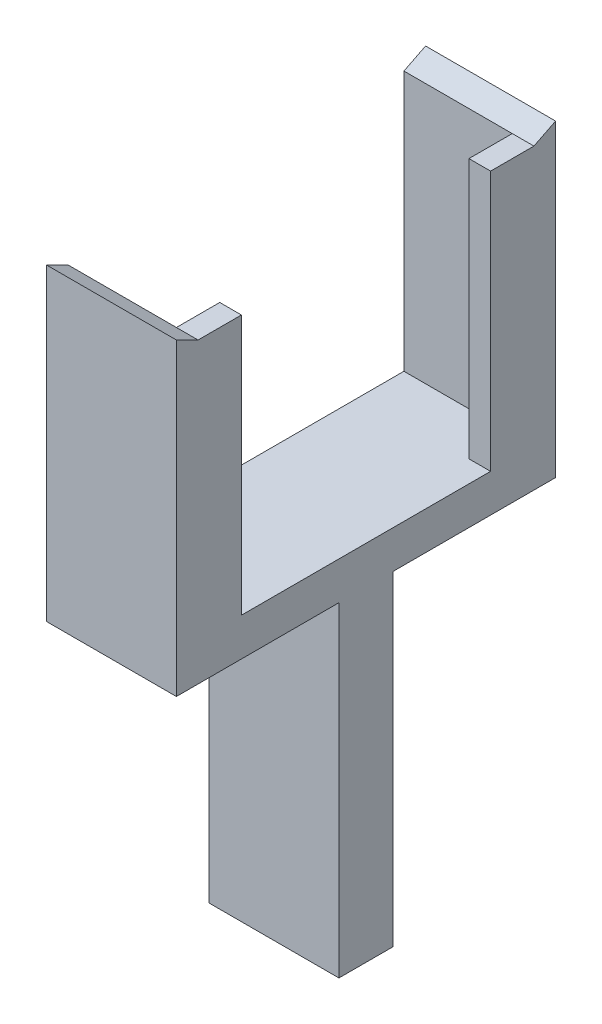
ISO-10303-21;
HEADER;
FILE_DESCRIPTION(('STEP AP214'),'2;1');
FILE_NAME('part.step','',(''),(''),'','','');
FILE_SCHEMA(('AUTOMOTIVE_DESIGN { 1 0 10303 214 1 1 1 1 }'));
ENDSEC;
DATA;
#1=APPLICATION_CONTEXT('core data for automotive mechanical design processes');
#2=APPLICATION_PROTOCOL_DEFINITION('international standard','automotive_design',2000,#1);
#3=PRODUCT_CONTEXT('',#1,'mechanical');
#4=PRODUCT('Part','Part','',(#3));
#5=PRODUCT_RELATED_PRODUCT_CATEGORY('part','',(#4));
#6=PRODUCT_DEFINITION_FORMATION('','',#4);
#7=PRODUCT_DEFINITION_CONTEXT('part definition',#1,'design');
#8=PRODUCT_DEFINITION('design','',#6,#7);
#9=PRODUCT_DEFINITION_SHAPE('','',#8);
#10=(LENGTH_UNIT() NAMED_UNIT(*) SI_UNIT(.MILLI.,.METRE.));
#11=(NAMED_UNIT(*) PLANE_ANGLE_UNIT() SI_UNIT($,.RADIAN.));
#12=(NAMED_UNIT(*) SI_UNIT($,.STERADIAN.) SOLID_ANGLE_UNIT());
#13=UNCERTAINTY_MEASURE_WITH_UNIT(LENGTH_MEASURE(1.E-05),#10,'distance_accuracy_value','');
#14=(GEOMETRIC_REPRESENTATION_CONTEXT(3) GLOBAL_UNCERTAINTY_ASSIGNED_CONTEXT((#13)) GLOBAL_UNIT_ASSIGNED_CONTEXT((#10,
#11,#12)) REPRESENTATION_CONTEXT('',''));
#15=CARTESIAN_POINT('',(0.,0.,0.));
#16=DIRECTION('',(0.,0.,1.));
#17=DIRECTION('',(1.,0.,0.));
#18=AXIS2_PLACEMENT_3D('',#15,#16,#17);
#19=CARTESIAN_POINT('',(6.,5.64115646258503,15.5));
#20=DIRECTION('',(0.,-1.,0.));
#21=DIRECTION('',(0.,0.,-1.));
#22=AXIS2_PLACEMENT_3D('',#19,#20,#21);
#23=PLANE('',#22);
#24=DIRECTION('',(-1.,0.,0.));
#25=VECTOR('',#24,1.);
#26=CARTESIAN_POINT('',(6.,5.64115646258503,-11.5));
#27=LINE('',#26,#25);
#28=CARTESIAN_POINT('',(6.,5.64115646258503,-11.5));
#29=VERTEX_POINT('',#28);
#30=CARTESIAN_POINT('',(4.,5.64115646258503,-11.5));
#31=VERTEX_POINT('',#30);
#32=EDGE_CURVE('E268',#29,#31,#27,.T.);
#33=ORIENTED_EDGE('',*,*,#32,.T.);
#34=DIRECTION('',(0.,0.,-1.));
#35=VECTOR('',#34,1.);
#36=CARTESIAN_POINT('',(4.,5.64115646258503,-11.5));
#37=LINE('',#36,#35);
#38=CARTESIAN_POINT('',(4.,5.64115646258503,-15.5));
#39=VERTEX_POINT('',#38);
#40=EDGE_CURVE('E265',#31,#39,#37,.T.);
#41=ORIENTED_EDGE('',*,*,#40,.T.);
#42=DIRECTION('',(-1.,0.,0.));
#43=VECTOR('',#42,1.);
#44=CARTESIAN_POINT('',(6.,5.64115646258503,-15.5));
#45=LINE('',#44,#43);
#46=CARTESIAN_POINT('',(-6.,5.64115646258503,-15.5));
#47=VERTEX_POINT('',#46);
#48=EDGE_CURVE('E190',#39,#47,#45,.T.);
#49=ORIENTED_EDGE('',*,*,#48,.T.);
#50=DIRECTION('',(0.,0.,1.));
#51=VECTOR('',#50,1.);
#52=CARTESIAN_POINT('',(-6.,5.64115646258503,15.5));
#53=LINE('',#52,#51);
#54=CARTESIAN_POINT('',(-6.,5.64115646258503,15.5));
#55=VERTEX_POINT('',#54);
#56=EDGE_CURVE('E169',#47,#55,#53,.T.);
#57=ORIENTED_EDGE('',*,*,#56,.T.);
#58=DIRECTION('',(-1.,0.,0.));
#59=VECTOR('',#58,1.);
#60=CARTESIAN_POINT('',(6.,5.64115646258503,15.5));
#61=LINE('',#60,#59);
#62=CARTESIAN_POINT('',(4.,5.64115646258503,15.5));
#63=VERTEX_POINT('',#62);
#64=EDGE_CURVE('E188',#63,#55,#61,.T.);
#65=ORIENTED_EDGE('',*,*,#64,.F.);
#66=DIRECTION('',(0.,0.,1.));
#67=VECTOR('',#66,1.);
#68=CARTESIAN_POINT('',(4.,5.64115646258503,11.5));
#69=LINE('',#68,#67);
#70=CARTESIAN_POINT('',(4.,5.64115646258503,11.5));
#71=VERTEX_POINT('',#70);
#72=EDGE_CURVE('E157',#71,#63,#69,.T.);
#73=ORIENTED_EDGE('',*,*,#72,.F.);
#74=DIRECTION('',(-1.,0.,0.));
#75=VECTOR('',#74,1.);
#76=CARTESIAN_POINT('',(6.,5.64115646258503,11.5));
#77=LINE('',#76,#75);
#78=CARTESIAN_POINT('',(6.,5.64115646258503,11.5));
#79=VERTEX_POINT('',#78);
#80=EDGE_CURVE('E255',#79,#71,#77,.T.);
#81=ORIENTED_EDGE('',*,*,#80,.F.);
#82=DIRECTION('',(0.,0.,1.));
#83=VECTOR('',#82,1.);
#84=CARTESIAN_POINT('',(6.,5.64115646258503,15.5));
#85=LINE('',#84,#83);
#86=EDGE_CURVE('E227',#29,#79,#85,.T.);
#87=ORIENTED_EDGE('',*,*,#86,.F.);
#88=EDGE_LOOP('',(#33,#41,#49,#57,#65,#73,#81,#87));
#89=FACE_BOUND('',#88,.T.);
#90=ADVANCED_FACE('F36',(#89),#23,.F.);
#91=CARTESIAN_POINT('',(6.,29.641156462585,15.5));
#92=DIRECTION('',(0.,0.,1.));
#93=DIRECTION('',(0.,-1.,0.));
#94=AXIS2_PLACEMENT_3D('',#91,#92,#93);
#95=PLANE('',#94);
#96=DIRECTION('',(0.,1.,0.));
#97=VECTOR('',#96,1.);
#98=CARTESIAN_POINT('',(4.,29.641156462585,15.5));
#99=LINE('',#98,#97);
#100=CARTESIAN_POINT('',(4.,29.641156462585,15.5));
#101=VERTEX_POINT('',#100);
#102=EDGE_CURVE('E245',#63,#101,#99,.T.);
#103=ORIENTED_EDGE('',*,*,#102,.F.);
#104=ORIENTED_EDGE('',*,*,#64,.T.);
#105=DIRECTION('',(0.,1.,0.));
#106=VECTOR('',#105,1.);
#107=CARTESIAN_POINT('',(-6.,29.641156462585,15.5));
#108=LINE('',#107,#106);
#109=CARTESIAN_POINT('',(-6.,29.641156462585,15.5));
#110=VERTEX_POINT('',#109);
#111=EDGE_CURVE('E172',#55,#110,#108,.T.);
#112=ORIENTED_EDGE('',*,*,#111,.T.);
#113=DIRECTION('',(-1.,0.,0.));
#114=VECTOR('',#113,1.);
#115=CARTESIAN_POINT('',(6.,29.641156462585,15.5));
#116=LINE('',#115,#114);
#117=EDGE_CURVE('E184',#101,#110,#116,.T.);
#118=ORIENTED_EDGE('',*,*,#117,.F.);
#119=EDGE_LOOP('',(#103,#104,#112,#118));
#120=FACE_BOUND('',#119,.T.);
#121=ADVANCED_FACE('F341',(#120),#95,.F.);
#122=CARTESIAN_POINT('',(6.,-27.858843537415,2.49999999999999));
#123=DIRECTION('',(0.,1.,0.));
#124=DIRECTION('',(0.,0.,1.));
#125=AXIS2_PLACEMENT_3D('',#122,#123,#124);
#126=PLANE('',#125);
#127=DIRECTION('',(0.,0.,-1.));
#128=VECTOR('',#127,1.);
#129=CARTESIAN_POINT('',(-6.,-27.858843537415,2.49999999999999));
#130=LINE('',#129,#128);
#131=CARTESIAN_POINT('',(-6.,-27.858843537415,2.49999999999999));
#132=VERTEX_POINT('',#131);
#133=CARTESIAN_POINT('',(-6.,-27.858843537415,-2.50000000000001));
#134=VERTEX_POINT('',#133);
#135=EDGE_CURVE('E153',#132,#134,#130,.T.);
#136=ORIENTED_EDGE('',*,*,#135,.T.);
#137=DIRECTION('',(-1.,0.,0.));
#138=VECTOR('',#137,1.);
#139=CARTESIAN_POINT('',(6.,-27.858843537415,-2.50000000000001));
#140=LINE('',#139,#138);
#141=CARTESIAN_POINT('',(6.,-27.858843537415,-2.50000000000001));
#142=VERTEX_POINT('',#141);
#143=EDGE_CURVE('E11',#142,#134,#140,.T.);
#144=ORIENTED_EDGE('',*,*,#143,.F.);
#145=DIRECTION('',(0.,0.,-1.));
#146=VECTOR('',#145,1.);
#147=CARTESIAN_POINT('',(6.,-27.858843537415,2.49999999999999));
#148=LINE('',#147,#146);
#149=CARTESIAN_POINT('',(6.,-27.858843537415,2.49999999999999));
#150=VERTEX_POINT('',#149);
#151=EDGE_CURVE('E180',#150,#142,#148,.T.);
#152=ORIENTED_EDGE('',*,*,#151,.F.);
#153=DIRECTION('',(-1.,0.,0.));
#154=VECTOR('',#153,1.);
#155=CARTESIAN_POINT('',(6.,-27.858843537415,2.49999999999999));
#156=LINE('',#155,#154);
#157=EDGE_CURVE('E149',#150,#132,#156,.T.);
#158=ORIENTED_EDGE('',*,*,#157,.T.);
#159=EDGE_LOOP('',(#136,#144,#152,#158));
#160=FACE_BOUND('',#159,.T.);
#161=ADVANCED_FACE('F38',(#160),#126,.F.);
#162=CARTESIAN_POINT('',(6.,-27.858843537415,-2.50000000000001));
#163=DIRECTION('',(0.,0.,1.));
#164=DIRECTION('',(0.,-1.,0.));
#165=AXIS2_PLACEMENT_3D('',#162,#163,#164);
#166=PLANE('',#165);
#167=DIRECTION('',(0.,1.,0.));
#168=VECTOR('',#167,1.);
#169=CARTESIAN_POINT('',(-6.,-27.858843537415,-2.50000000000001));
#170=LINE('',#169,#168);
#171=CARTESIAN_POINT('',(-6.,2.14115646258503,-2.5));
#172=VERTEX_POINT('',#171);
#173=EDGE_CURVE('E156',#134,#172,#170,.T.);
#174=ORIENTED_EDGE('',*,*,#173,.T.);
#175=DIRECTION('',(-1.,0.,0.));
#176=VECTOR('',#175,1.);
#177=CARTESIAN_POINT('',(6.,2.14115646258503,-2.5));
#178=LINE('',#177,#176);
#179=CARTESIAN_POINT('',(6.,2.14115646258503,-2.5));
#180=VERTEX_POINT('',#179);
#181=EDGE_CURVE('E45',#180,#172,#178,.T.);
#182=ORIENTED_EDGE('',*,*,#181,.F.);
#183=DIRECTION('',(0.,1.,0.));
#184=VECTOR('',#183,1.);
#185=CARTESIAN_POINT('',(6.,-27.858843537415,-2.50000000000001));
#186=LINE('',#185,#184);
#187=EDGE_CURVE('E109',#142,#180,#186,.T.);
#188=ORIENTED_EDGE('',*,*,#187,.F.);
#189=ORIENTED_EDGE('',*,*,#143,.T.);
#190=EDGE_LOOP('',(#174,#182,#188,#189));
#191=FACE_BOUND('',#190,.T.);
#192=ADVANCED_FACE('F372',(#191),#166,.F.);
#193=CARTESIAN_POINT('',(6.,2.14115646258503,-2.5));
#194=DIRECTION('',(0.,1.,0.));
#195=DIRECTION('',(0.,0.,1.));
#196=AXIS2_PLACEMENT_3D('',#193,#194,#195);
#197=PLANE('',#196);
#198=DIRECTION('',(0.,0.,-1.));
#199=VECTOR('',#198,1.);
#200=CARTESIAN_POINT('',(-6.,2.14115646258503,-2.5));
#201=LINE('',#200,#199);
#202=CARTESIAN_POINT('',(-6.,2.14115646258503,-17.5));
#203=VERTEX_POINT('',#202);
#204=EDGE_CURVE('E159',#172,#203,#201,.T.);
#205=ORIENTED_EDGE('',*,*,#204,.T.);
#206=DIRECTION('',(-1.,0.,0.));
#207=VECTOR('',#206,1.);
#208=CARTESIAN_POINT('',(6.,2.14115646258503,-17.5));
#209=LINE('',#208,#207);
#210=CARTESIAN_POINT('',(6.,2.14115646258503,-17.5));
#211=VERTEX_POINT('',#210);
#212=EDGE_CURVE('E199',#211,#203,#209,.T.);
#213=ORIENTED_EDGE('',*,*,#212,.F.);
#214=DIRECTION('',(0.,0.,-1.));
#215=VECTOR('',#214,1.);
#216=CARTESIAN_POINT('',(6.,2.14115646258503,-2.5));
#217=LINE('',#216,#215);
#218=EDGE_CURVE('E207',#180,#211,#217,.T.);
#219=ORIENTED_EDGE('',*,*,#218,.F.);
#220=ORIENTED_EDGE('',*,*,#181,.T.);
#221=EDGE_LOOP('',(#205,#213,#219,#220));
#222=FACE_BOUND('',#221,.T.);
#223=ADVANCED_FACE('F205',(#222),#197,.F.);
#224=CARTESIAN_POINT('',(6.,2.14115646258503,-17.5));
#225=DIRECTION('',(0.,0.,1.));
#226=DIRECTION('',(0.,-1.,0.));
#227=AXIS2_PLACEMENT_3D('',#224,#225,#226);
#228=PLANE('',#227);
#229=DIRECTION('',(0.,1.,0.));
#230=VECTOR('',#229,1.);
#231=CARTESIAN_POINT('',(-6.,2.14115646258503,-17.5));
#232=LINE('',#231,#230);
#233=CARTESIAN_POINT('',(-6.,30.641156462585,-17.5));
#234=VERTEX_POINT('',#233);
#235=EDGE_CURVE('E161',#203,#234,#232,.T.);
#236=ORIENTED_EDGE('',*,*,#235,.T.);
#237=DIRECTION('',(-1.,0.,0.));
#238=VECTOR('',#237,1.);
#239=CARTESIAN_POINT('',(6.,30.641156462585,-17.5));
#240=LINE('',#239,#238);
#241=CARTESIAN_POINT('',(6.,30.641156462585,-17.5));
#242=VERTEX_POINT('',#241);
#243=EDGE_CURVE('E196',#242,#234,#240,.T.);
#244=ORIENTED_EDGE('',*,*,#243,.F.);
#245=DIRECTION('',(0.,1.,0.));
#246=VECTOR('',#245,1.);
#247=CARTESIAN_POINT('',(6.,2.14115646258503,-17.5));
#248=LINE('',#247,#246);
#249=EDGE_CURVE('E228',#211,#242,#248,.T.);
#250=ORIENTED_EDGE('',*,*,#249,.F.);
#251=ORIENTED_EDGE('',*,*,#212,.T.);
#252=EDGE_LOOP('',(#236,#244,#250,#251));
#253=FACE_BOUND('',#252,.T.);
#254=ADVANCED_FACE('F216',(#253),#228,.F.);
#255=CARTESIAN_POINT('',(6.,30.641156462585,-17.5));
#256=DIRECTION('',(0.,-0.894427190999916,-0.447213595499958));
#257=DIRECTION('',(0.,0.447213595499958,-0.894427190999916));
#258=AXIS2_PLACEMENT_3D('',#255,#256,#257);
#259=PLANE('',#258);
#260=DIRECTION('',(0.,-0.447213595499958,0.894427190999916));
#261=VECTOR('',#260,1.);
#262=CARTESIAN_POINT('',(-6.,30.641156462585,-17.5));
#263=LINE('',#262,#261);
#264=CARTESIAN_POINT('',(-6.,29.641156462585,-15.5));
#265=VERTEX_POINT('',#264);
#266=EDGE_CURVE('E163',#234,#265,#263,.T.);
#267=ORIENTED_EDGE('',*,*,#266,.T.);
#268=DIRECTION('',(-1.,0.,0.));
#269=VECTOR('',#268,1.);
#270=CARTESIAN_POINT('',(6.,29.641156462585,-15.5));
#271=LINE('',#270,#269);
#272=CARTESIAN_POINT('',(4.,29.641156462585,-15.5));
#273=VERTEX_POINT('',#272);
#274=EDGE_CURVE('E192',#273,#265,#271,.T.);
#275=ORIENTED_EDGE('',*,*,#274,.F.);
#276=CARTESIAN_POINT('',(6.,29.641156462585,-15.5));
#277=VERTEX_POINT('',#276);
#278=EDGE_CURVE('E193',#277,#273,#271,.T.);
#279=ORIENTED_EDGE('',*,*,#278,.F.);
#280=DIRECTION('',(0.,-0.447213595499958,0.894427190999916));
#281=VECTOR('',#280,1.);
#282=CARTESIAN_POINT('',(6.,30.641156462585,-17.5));
#283=LINE('',#282,#281);
#284=EDGE_CURVE('E224',#242,#277,#283,.T.);
#285=ORIENTED_EDGE('',*,*,#284,.F.);
#286=ORIENTED_EDGE('',*,*,#243,.T.);
#287=EDGE_LOOP('',(#267,#275,#279,#285,#286));
#288=FACE_BOUND('',#287,.T.);
#289=ADVANCED_FACE('F220',(#288),#259,.F.);
#290=CARTESIAN_POINT('',(6.,29.641156462585,-15.5));
#291=DIRECTION('',(0.,0.,-1.));
#292=DIRECTION('',(0.,1.,0.));
#293=AXIS2_PLACEMENT_3D('',#290,#291,#292);
#294=PLANE('',#293);
#295=ORIENTED_EDGE('',*,*,#48,.F.);
#296=DIRECTION('',(0.,1.,0.));
#297=VECTOR('',#296,1.);
#298=CARTESIAN_POINT('',(4.,29.641156462585,-15.5));
#299=LINE('',#298,#297);
#300=EDGE_CURVE('E269',#39,#273,#299,.T.);
#301=ORIENTED_EDGE('',*,*,#300,.T.);
#302=ORIENTED_EDGE('',*,*,#274,.T.);
#303=DIRECTION('',(0.,-1.,0.));
#304=VECTOR('',#303,1.);
#305=CARTESIAN_POINT('',(-6.,29.641156462585,-15.5));
#306=LINE('',#305,#304);
#307=EDGE_CURVE('E166',#265,#47,#306,.T.);
#308=ORIENTED_EDGE('',*,*,#307,.T.);
#309=EDGE_LOOP('',(#295,#301,#302,#308));
#310=FACE_BOUND('',#309,.T.);
#311=ADVANCED_FACE('F336',(#310),#294,.F.);
#312=CARTESIAN_POINT('',(6.,30.641156462585,17.5));
#313=DIRECTION('',(0.,-0.894427190999916,0.447213595499958));
#314=DIRECTION('',(0.,-0.447213595499958,-0.894427190999916));
#315=AXIS2_PLACEMENT_3D('',#312,#313,#314);
#316=PLANE('',#315);
#317=DIRECTION('',(0.,0.447213595499958,0.894427190999916));
#318=VECTOR('',#317,1.);
#319=CARTESIAN_POINT('',(-6.,30.641156462585,17.5));
#320=LINE('',#319,#318);
#321=CARTESIAN_POINT('',(-6.,30.641156462585,17.5));
#322=VERTEX_POINT('',#321);
#323=EDGE_CURVE('E175',#110,#322,#320,.T.);
#324=ORIENTED_EDGE('',*,*,#323,.T.);
#325=DIRECTION('',(-1.,0.,0.));
#326=VECTOR('',#325,1.);
#327=CARTESIAN_POINT('',(6.,30.641156462585,17.5));
#328=LINE('',#327,#326);
#329=CARTESIAN_POINT('',(6.,30.641156462585,17.5));
#330=VERTEX_POINT('',#329);
#331=EDGE_CURVE('E144',#330,#322,#328,.T.);
#332=ORIENTED_EDGE('',*,*,#331,.F.);
#333=DIRECTION('',(0.,0.447213595499958,0.894427190999916));
#334=VECTOR('',#333,1.);
#335=CARTESIAN_POINT('',(6.,30.641156462585,17.5));
#336=LINE('',#335,#334);
#337=CARTESIAN_POINT('',(6.,29.641156462585,15.5));
#338=VERTEX_POINT('',#337);
#339=EDGE_CURVE('E135',#338,#330,#336,.T.);
#340=ORIENTED_EDGE('',*,*,#339,.F.);
#341=EDGE_CURVE('E185',#338,#101,#116,.T.);
#342=ORIENTED_EDGE('',*,*,#341,.T.);
#343=ORIENTED_EDGE('',*,*,#117,.T.);
#344=EDGE_LOOP('',(#324,#332,#340,#342,#343));
#345=FACE_BOUND('',#344,.T.);
#346=ADVANCED_FACE('F343',(#345),#316,.F.);
#347=CARTESIAN_POINT('',(6.,2.14115646258502,17.5));
#348=DIRECTION('',(0.,0.,-1.));
#349=DIRECTION('',(0.,1.,0.));
#350=AXIS2_PLACEMENT_3D('',#347,#348,#349);
#351=PLANE('',#350);
#352=DIRECTION('',(0.,-1.,0.));
#353=VECTOR('',#352,1.);
#354=CARTESIAN_POINT('',(-6.,2.14115646258502,17.5));
#355=LINE('',#354,#353);
#356=CARTESIAN_POINT('',(-6.,2.14115646258502,17.5));
#357=VERTEX_POINT('',#356);
#358=EDGE_CURVE('E143',#322,#357,#355,.T.);
#359=ORIENTED_EDGE('',*,*,#358,.T.);
#360=DIRECTION('',(-1.,0.,0.));
#361=VECTOR('',#360,1.);
#362=CARTESIAN_POINT('',(6.,2.14115646258502,17.5));
#363=LINE('',#362,#361);
#364=CARTESIAN_POINT('',(6.,2.14115646258502,17.5));
#365=VERTEX_POINT('',#364);
#366=EDGE_CURVE('E140',#365,#357,#363,.T.);
#367=ORIENTED_EDGE('',*,*,#366,.F.);
#368=DIRECTION('',(0.,-1.,0.));
#369=VECTOR('',#368,1.);
#370=CARTESIAN_POINT('',(6.,2.14115646258502,17.5));
#371=LINE('',#370,#369);
#372=EDGE_CURVE('E128',#330,#365,#371,.T.);
#373=ORIENTED_EDGE('',*,*,#372,.F.);
#374=ORIENTED_EDGE('',*,*,#331,.T.);
#375=EDGE_LOOP('',(#359,#367,#373,#374));
#376=FACE_BOUND('',#375,.T.);
#377=ADVANCED_FACE('F141',(#376),#351,.F.);
#378=CARTESIAN_POINT('',(6.,2.14115646258503,2.49999999999999));
#379=DIRECTION('',(0.,1.,0.));
#380=DIRECTION('',(0.,0.,1.));
#381=AXIS2_PLACEMENT_3D('',#378,#379,#380);
#382=PLANE('',#381);
#383=DIRECTION('',(0.,0.,-1.));
#384=VECTOR('',#383,1.);
#385=CARTESIAN_POINT('',(-6.,2.14115646258503,2.49999999999999));
#386=LINE('',#385,#384);
#387=CARTESIAN_POINT('',(-6.,2.14115646258503,2.49999999999999));
#388=VERTEX_POINT('',#387);
#389=EDGE_CURVE('E95',#357,#388,#386,.T.);
#390=ORIENTED_EDGE('',*,*,#389,.T.);
#391=DIRECTION('',(-1.,0.,0.));
#392=VECTOR('',#391,1.);
#393=CARTESIAN_POINT('',(6.,2.14115646258503,2.49999999999999));
#394=LINE('',#393,#392);
#395=CARTESIAN_POINT('',(6.,2.14115646258503,2.49999999999999));
#396=VERTEX_POINT('',#395);
#397=EDGE_CURVE('E145',#396,#388,#394,.T.);
#398=ORIENTED_EDGE('',*,*,#397,.F.);
#399=DIRECTION('',(0.,0.,-1.));
#400=VECTOR('',#399,1.);
#401=CARTESIAN_POINT('',(6.,2.14115646258503,2.49999999999999));
#402=LINE('',#401,#400);
#403=EDGE_CURVE('E133',#365,#396,#402,.T.);
#404=ORIENTED_EDGE('',*,*,#403,.F.);
#405=ORIENTED_EDGE('',*,*,#366,.T.);
#406=EDGE_LOOP('',(#390,#398,#404,#405));
#407=FACE_BOUND('',#406,.T.);
#408=ADVANCED_FACE('F147',(#407),#382,.F.);
#409=CARTESIAN_POINT('',(6.,-27.858843537415,2.49999999999999));
#410=DIRECTION('',(0.,0.,-1.));
#411=DIRECTION('',(-1.,0.,0.));
#412=AXIS2_PLACEMENT_3D('',#409,#410,#411);
#413=PLANE('',#412);
#414=DIRECTION('',(0.,-1.,0.));
#415=VECTOR('',#414,1.);
#416=CARTESIAN_POINT('',(-6.,-27.858843537415,2.49999999999999));
#417=LINE('',#416,#415);
#418=EDGE_CURVE('E101',#388,#132,#417,.T.);
#419=ORIENTED_EDGE('',*,*,#418,.T.);
#420=ORIENTED_EDGE('',*,*,#157,.F.);
#421=DIRECTION('',(0.,-1.,0.));
#422=VECTOR('',#421,1.);
#423=CARTESIAN_POINT('',(6.,-27.858843537415,2.49999999999999));
#424=LINE('',#423,#422);
#425=EDGE_CURVE('E53',#396,#150,#424,.T.);
#426=ORIENTED_EDGE('',*,*,#425,.F.);
#427=ORIENTED_EDGE('',*,*,#397,.T.);
#428=EDGE_LOOP('',(#419,#420,#426,#427));
#429=FACE_BOUND('',#428,.T.);
#430=ADVANCED_FACE('F347',(#429),#413,.F.);
#431=CARTESIAN_POINT('',(6.,0.,0.));
#432=DIRECTION('',(1.,0.,0.));
#433=DIRECTION('',(0.,0.,-1.));
#434=AXIS2_PLACEMENT_3D('',#431,#432,#433);
#435=PLANE('',#434);
#436=DIRECTION('',(0.,-1.,0.));
#437=VECTOR('',#436,1.);
#438=CARTESIAN_POINT('',(6.,29.641156462585,-11.5));
#439=LINE('',#438,#437);
#440=CARTESIAN_POINT('',(6.,29.641156462585,-11.5));
#441=VERTEX_POINT('',#440);
#442=EDGE_CURVE('E272',#441,#29,#439,.T.);
#443=ORIENTED_EDGE('',*,*,#442,.T.);
#444=ORIENTED_EDGE('',*,*,#86,.T.);
#445=DIRECTION('',(0.,-1.,0.));
#446=VECTOR('',#445,1.);
#447=CARTESIAN_POINT('',(6.,29.641156462585,11.5));
#448=LINE('',#447,#446);
#449=CARTESIAN_POINT('',(6.,29.641156462585,11.5));
#450=VERTEX_POINT('',#449);
#451=EDGE_CURVE('E248',#450,#79,#448,.T.);
#452=ORIENTED_EDGE('',*,*,#451,.F.);
#453=DIRECTION('',(0.,0.,1.));
#454=VECTOR('',#453,1.);
#455=CARTESIAN_POINT('',(6.,29.641156462585,11.5));
#456=LINE('',#455,#454);
#457=EDGE_CURVE('E242',#450,#338,#456,.T.);
#458=ORIENTED_EDGE('',*,*,#457,.T.);
#459=ORIENTED_EDGE('',*,*,#339,.T.);
#460=ORIENTED_EDGE('',*,*,#372,.T.);
#461=ORIENTED_EDGE('',*,*,#403,.T.);
#462=ORIENTED_EDGE('',*,*,#425,.T.);
#463=ORIENTED_EDGE('',*,*,#151,.T.);
#464=ORIENTED_EDGE('',*,*,#187,.T.);
#465=ORIENTED_EDGE('',*,*,#218,.T.);
#466=ORIENTED_EDGE('',*,*,#249,.T.);
#467=ORIENTED_EDGE('',*,*,#284,.T.);
#468=DIRECTION('',(0.,0.,-1.));
#469=VECTOR('',#468,1.);
#470=CARTESIAN_POINT('',(6.,29.641156462585,-11.5));
#471=LINE('',#470,#469);
#472=EDGE_CURVE('E249',#441,#277,#471,.T.);
#473=ORIENTED_EDGE('',*,*,#472,.F.);
#474=EDGE_LOOP('',(#443,#444,#452,#458,#459,#460,#461,#462,#463,#464,#465,#466,#467,#473));
#475=FACE_BOUND('',#474,.T.);
#476=ADVANCED_FACE('F131',(#475),#435,.T.);
#477=CARTESIAN_POINT('',(-6.,0.,0.));
#478=DIRECTION('',(1.,0.,0.));
#479=DIRECTION('',(0.,0.,-1.));
#480=AXIS2_PLACEMENT_3D('',#477,#478,#479);
#481=PLANE('',#480);
#482=ORIENTED_EDGE('',*,*,#135,.F.);
#483=ORIENTED_EDGE('',*,*,#418,.F.);
#484=ORIENTED_EDGE('',*,*,#389,.F.);
#485=ORIENTED_EDGE('',*,*,#358,.F.);
#486=ORIENTED_EDGE('',*,*,#323,.F.);
#487=ORIENTED_EDGE('',*,*,#111,.F.);
#488=ORIENTED_EDGE('',*,*,#56,.F.);
#489=ORIENTED_EDGE('',*,*,#307,.F.);
#490=ORIENTED_EDGE('',*,*,#266,.F.);
#491=ORIENTED_EDGE('',*,*,#235,.F.);
#492=ORIENTED_EDGE('',*,*,#204,.F.);
#493=ORIENTED_EDGE('',*,*,#173,.F.);
#494=EDGE_LOOP('',(#482,#483,#484,#485,#486,#487,#488,#489,#490,#491,#492,#493));
#495=FACE_BOUND('',#494,.T.);
#496=ADVANCED_FACE('F211',(#495),#481,.F.);
#497=CARTESIAN_POINT('',(4.,29.641156462585,11.5));
#498=DIRECTION('',(1.,0.,0.));
#499=DIRECTION('',(0.,1.,0.));
#500=AXIS2_PLACEMENT_3D('',#497,#498,#499);
#501=PLANE('',#500);
#502=ORIENTED_EDGE('',*,*,#102,.T.);
#503=DIRECTION('',(0.,0.,1.));
#504=VECTOR('',#503,1.);
#505=CARTESIAN_POINT('',(4.,29.641156462585,11.5));
#506=LINE('',#505,#504);
#507=CARTESIAN_POINT('',(4.,29.641156462585,11.5));
#508=VERTEX_POINT('',#507);
#509=EDGE_CURVE('E239',#508,#101,#506,.T.);
#510=ORIENTED_EDGE('',*,*,#509,.F.);
#511=DIRECTION('',(0.,1.,0.));
#512=VECTOR('',#511,1.);
#513=CARTESIAN_POINT('',(4.,29.641156462585,11.5));
#514=LINE('',#513,#512);
#515=EDGE_CURVE('E252',#71,#508,#514,.T.);
#516=ORIENTED_EDGE('',*,*,#515,.F.);
#517=ORIENTED_EDGE('',*,*,#72,.T.);
#518=EDGE_LOOP('',(#502,#510,#516,#517));
#519=FACE_BOUND('',#518,.T.);
#520=ADVANCED_FACE('F308',(#519),#501,.F.);
#521=CARTESIAN_POINT('',(6.,29.641156462585,11.5));
#522=DIRECTION('',(0.,-1.,0.));
#523=DIRECTION('',(0.,0.,-1.));
#524=AXIS2_PLACEMENT_3D('',#521,#522,#523);
#525=PLANE('',#524);
#526=ORIENTED_EDGE('',*,*,#341,.F.);
#527=ORIENTED_EDGE('',*,*,#457,.F.);
#528=DIRECTION('',(1.,0.,0.));
#529=VECTOR('',#528,1.);
#530=CARTESIAN_POINT('',(6.,29.641156462585,11.5));
#531=LINE('',#530,#529);
#532=EDGE_CURVE('E244',#508,#450,#531,.T.);
#533=ORIENTED_EDGE('',*,*,#532,.F.);
#534=ORIENTED_EDGE('',*,*,#509,.T.);
#535=EDGE_LOOP('',(#526,#527,#533,#534));
#536=FACE_BOUND('',#535,.T.);
#537=ADVANCED_FACE('F316',(#536),#525,.F.);
#538=CARTESIAN_POINT('',(0.,0.,11.5));
#539=DIRECTION('',(0.,0.,-1.));
#540=DIRECTION('',(0.,1.,0.));
#541=AXIS2_PLACEMENT_3D('',#538,#539,#540);
#542=PLANE('',#541);
#543=ORIENTED_EDGE('',*,*,#451,.T.);
#544=ORIENTED_EDGE('',*,*,#80,.T.);
#545=ORIENTED_EDGE('',*,*,#515,.T.);
#546=ORIENTED_EDGE('',*,*,#532,.T.);
#547=EDGE_LOOP('',(#543,#544,#545,#546));
#548=FACE_BOUND('',#547,.T.);
#549=ADVANCED_FACE('F303',(#548),#542,.T.);
#550=CARTESIAN_POINT('',(6.,29.641156462585,-11.5));
#551=DIRECTION('',(0.,1.,0.));
#552=DIRECTION('',(0.,0.,1.));
#553=AXIS2_PLACEMENT_3D('',#550,#551,#552);
#554=PLANE('',#553);
#555=ORIENTED_EDGE('',*,*,#278,.T.);
#556=DIRECTION('',(0.,0.,-1.));
#557=VECTOR('',#556,1.);
#558=CARTESIAN_POINT('',(4.,29.641156462585,-11.5));
#559=LINE('',#558,#557);
#560=CARTESIAN_POINT('',(4.,29.641156462585,-11.5));
#561=VERTEX_POINT('',#560);
#562=EDGE_CURVE('E262',#561,#273,#559,.T.);
#563=ORIENTED_EDGE('',*,*,#562,.F.);
#564=DIRECTION('',(1.,0.,0.));
#565=VECTOR('',#564,1.);
#566=CARTESIAN_POINT('',(6.,29.641156462585,-11.5));
#567=LINE('',#566,#565);
#568=EDGE_CURVE('E278',#561,#441,#567,.T.);
#569=ORIENTED_EDGE('',*,*,#568,.T.);
#570=ORIENTED_EDGE('',*,*,#472,.T.);
#571=EDGE_LOOP('',(#555,#563,#569,#570));
#572=FACE_BOUND('',#571,.T.);
#573=ADVANCED_FACE('F331',(#572),#554,.T.);
#574=CARTESIAN_POINT('',(4.,29.641156462585,-11.5));
#575=DIRECTION('',(-1.,0.,0.));
#576=DIRECTION('',(0.,-1.,0.));
#577=AXIS2_PLACEMENT_3D('',#574,#575,#576);
#578=PLANE('',#577);
#579=ORIENTED_EDGE('',*,*,#300,.F.);
#580=ORIENTED_EDGE('',*,*,#40,.F.);
#581=DIRECTION('',(0.,1.,0.));
#582=VECTOR('',#581,1.);
#583=CARTESIAN_POINT('',(4.,29.641156462585,-11.5));
#584=LINE('',#583,#582);
#585=EDGE_CURVE('E275',#31,#561,#584,.T.);
#586=ORIENTED_EDGE('',*,*,#585,.T.);
#587=ORIENTED_EDGE('',*,*,#562,.T.);
#588=EDGE_LOOP('',(#579,#580,#586,#587));
#589=FACE_BOUND('',#588,.T.);
#590=ADVANCED_FACE('F333',(#589),#578,.T.);
#591=CARTESIAN_POINT('',(0.,0.,-11.5));
#592=DIRECTION('',(0.,0.,1.));
#593=DIRECTION('',(0.,1.,0.));
#594=AXIS2_PLACEMENT_3D('',#591,#592,#593);
#595=PLANE('',#594);
#596=ORIENTED_EDGE('',*,*,#442,.F.);
#597=ORIENTED_EDGE('',*,*,#568,.F.);
#598=ORIENTED_EDGE('',*,*,#585,.F.);
#599=ORIENTED_EDGE('',*,*,#32,.F.);
#600=EDGE_LOOP('',(#596,#597,#598,#599));
#601=FACE_BOUND('',#600,.T.);
#602=ADVANCED_FACE('F294',(#601),#595,.T.);
#603=CLOSED_SHELL('',(#90,#121,#161,#192,#223,#254,#289,#311,#346,#377,#408,#430,#476,#496,#520,
#537,#549,#573,#590,#602));
#604=MANIFOLD_SOLID_BREP('B2',#603);
#605=ADVANCED_BREP_SHAPE_REPRESENTATION('',(#18,#604),#14);
#606=SHAPE_DEFINITION_REPRESENTATION(#9,#605);
ENDSEC;
END-ISO-10303-21;
